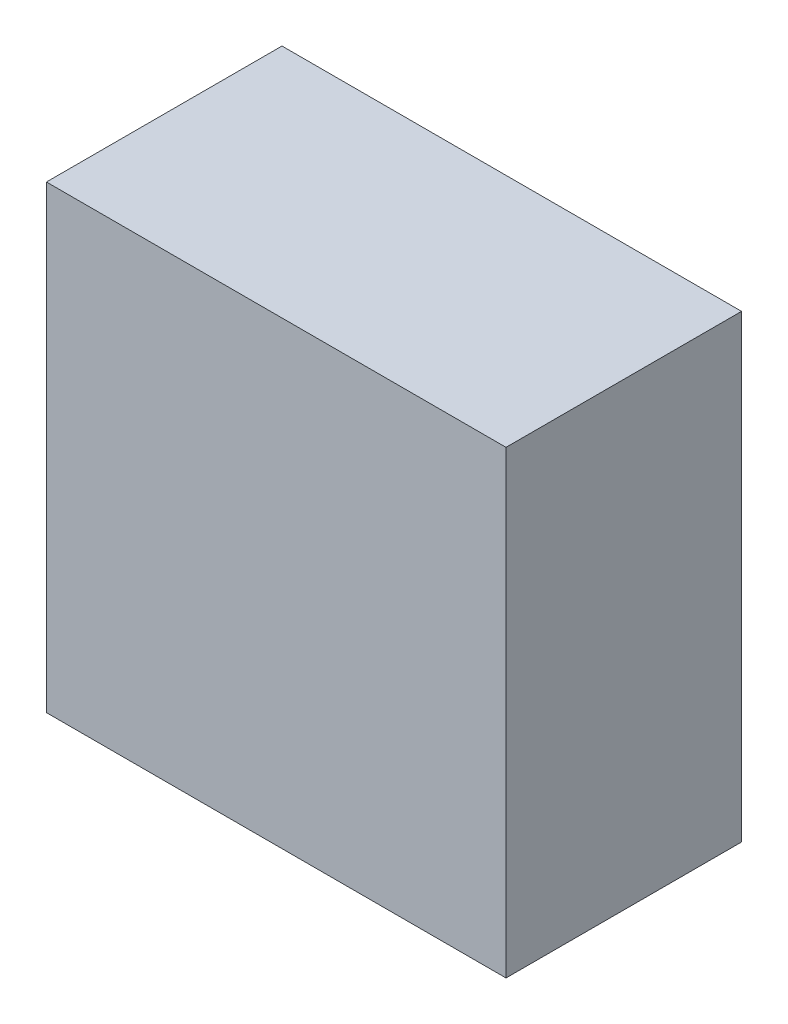
ISO-10303-21;
HEADER;
FILE_DESCRIPTION(('STEP AP214'),'2;1');
FILE_NAME('part.step','',(''),(''),'','','');
FILE_SCHEMA(('AUTOMOTIVE_DESIGN { 1 0 10303 214 1 1 1 1 }'));
ENDSEC;
DATA;
#1=APPLICATION_CONTEXT('core data for automotive mechanical design processes');
#2=APPLICATION_PROTOCOL_DEFINITION('international standard','automotive_design',2000,#1);
#3=PRODUCT_CONTEXT('',#1,'mechanical');
#4=PRODUCT('Part','Part','',(#3));
#5=PRODUCT_RELATED_PRODUCT_CATEGORY('part','',(#4));
#6=PRODUCT_DEFINITION_FORMATION('','',#4);
#7=PRODUCT_DEFINITION_CONTEXT('part definition',#1,'design');
#8=PRODUCT_DEFINITION('design','',#6,#7);
#9=PRODUCT_DEFINITION_SHAPE('','',#8);
#10=(LENGTH_UNIT() NAMED_UNIT(*) SI_UNIT(.MILLI.,.METRE.));
#11=(NAMED_UNIT(*) PLANE_ANGLE_UNIT() SI_UNIT($,.RADIAN.));
#12=(NAMED_UNIT(*) SI_UNIT($,.STERADIAN.) SOLID_ANGLE_UNIT());
#13=UNCERTAINTY_MEASURE_WITH_UNIT(LENGTH_MEASURE(1.E-05),#10,'distance_accuracy_value','');
#14=(GEOMETRIC_REPRESENTATION_CONTEXT(3) GLOBAL_UNCERTAINTY_ASSIGNED_CONTEXT((#13)) GLOBAL_UNIT_ASSIGNED_CONTEXT((#10,
#11,#12)) REPRESENTATION_CONTEXT('',''));
#15=CARTESIAN_POINT('',(0.,0.,0.));
#16=DIRECTION('',(0.,0.,1.));
#17=DIRECTION('',(1.,0.,0.));
#18=AXIS2_PLACEMENT_3D('',#15,#16,#17);
#19=CARTESIAN_POINT('',(-8.,-8.,4.1));
#20=DIRECTION('',(0.,0.,1.));
#21=DIRECTION('',(1.,0.,0.));
#22=AXIS2_PLACEMENT_3D('',#19,#20,#21);
#23=PLANE('',#22);
#24=DIRECTION('',(0.,1.,0.));
#25=VECTOR('',#24,1.);
#26=CARTESIAN_POINT('',(-8.,-8.,4.1));
#27=LINE('',#26,#25);
#28=CARTESIAN_POINT('',(-8.,-8.,4.1));
#29=VERTEX_POINT('',#28);
#30=CARTESIAN_POINT('',(-8.,8.,4.1));
#31=VERTEX_POINT('',#30);
#32=EDGE_CURVE('E86',#29,#31,#27,.T.);
#33=ORIENTED_EDGE('',*,*,#32,.F.);
#34=DIRECTION('',(1.,0.,0.));
#35=VECTOR('',#34,1.);
#36=CARTESIAN_POINT('',(-8.,-8.,4.1));
#37=LINE('',#36,#35);
#38=CARTESIAN_POINT('',(8.,-8.,4.1));
#39=VERTEX_POINT('',#38);
#40=EDGE_CURVE('E68',#29,#39,#37,.T.);
#41=ORIENTED_EDGE('',*,*,#40,.T.);
#42=DIRECTION('',(0.,1.,0.));
#43=VECTOR('',#42,1.);
#44=CARTESIAN_POINT('',(8.,-8.,4.1));
#45=LINE('',#44,#43);
#46=CARTESIAN_POINT('',(8.,8.,4.1));
#47=VERTEX_POINT('',#46);
#48=EDGE_CURVE('E80',#39,#47,#45,.T.);
#49=ORIENTED_EDGE('',*,*,#48,.T.);
#50=DIRECTION('',(1.,0.,0.));
#51=VECTOR('',#50,1.);
#52=CARTESIAN_POINT('',(-8.,8.,4.1));
#53=LINE('',#52,#51);
#54=EDGE_CURVE('E9',#31,#47,#53,.T.);
#55=ORIENTED_EDGE('',*,*,#54,.F.);
#56=EDGE_LOOP('',(#33,#41,#49,#55));
#57=FACE_BOUND('',#56,.T.);
#58=ADVANCED_FACE('F15',(#57),#23,.T.);
#59=CARTESIAN_POINT('',(-8.,-8.,-4.1));
#60=DIRECTION('',(0.,0.,1.));
#61=DIRECTION('',(1.,0.,0.));
#62=AXIS2_PLACEMENT_3D('',#59,#60,#61);
#63=PLANE('',#62);
#64=DIRECTION('',(1.,0.,0.));
#65=VECTOR('',#64,1.);
#66=CARTESIAN_POINT('',(-8.,8.,-4.1));
#67=LINE('',#66,#65);
#68=CARTESIAN_POINT('',(-8.,8.,-4.1));
#69=VERTEX_POINT('',#68);
#70=CARTESIAN_POINT('',(8.,8.,-4.1));
#71=VERTEX_POINT('',#70);
#72=EDGE_CURVE('E23',#69,#71,#67,.T.);
#73=ORIENTED_EDGE('',*,*,#72,.T.);
#74=DIRECTION('',(0.,1.,0.));
#75=VECTOR('',#74,1.);
#76=CARTESIAN_POINT('',(8.,-8.,-4.1));
#77=LINE('',#76,#75);
#78=CARTESIAN_POINT('',(8.,-8.,-4.1));
#79=VERTEX_POINT('',#78);
#80=EDGE_CURVE('E101',#79,#71,#77,.T.);
#81=ORIENTED_EDGE('',*,*,#80,.F.);
#82=DIRECTION('',(1.,0.,0.));
#83=VECTOR('',#82,1.);
#84=CARTESIAN_POINT('',(-8.,-8.,-4.1));
#85=LINE('',#84,#83);
#86=CARTESIAN_POINT('',(-8.,-8.,-4.1));
#87=VERTEX_POINT('',#86);
#88=EDGE_CURVE('E79',#87,#79,#85,.T.);
#89=ORIENTED_EDGE('',*,*,#88,.F.);
#90=DIRECTION('',(0.,1.,0.));
#91=VECTOR('',#90,1.);
#92=CARTESIAN_POINT('',(-8.,-8.,-4.1));
#93=LINE('',#92,#91);
#94=EDGE_CURVE('E87',#87,#69,#93,.T.);
#95=ORIENTED_EDGE('',*,*,#94,.T.);
#96=EDGE_LOOP('',(#73,#81,#89,#95));
#97=FACE_BOUND('',#96,.T.);
#98=ADVANCED_FACE('F114',(#97),#63,.F.);
#99=CARTESIAN_POINT('',(-8.,8.,-4.1));
#100=DIRECTION('',(0.,1.,0.));
#101=DIRECTION('',(1.,0.,0.));
#102=AXIS2_PLACEMENT_3D('',#99,#100,#101);
#103=PLANE('',#102);
#104=ORIENTED_EDGE('',*,*,#72,.F.);
#105=DIRECTION('',(0.,0.,1.));
#106=VECTOR('',#105,1.);
#107=CARTESIAN_POINT('',(-8.,8.,-4.1));
#108=LINE('',#107,#106);
#109=EDGE_CURVE('E91',#69,#31,#108,.T.);
#110=ORIENTED_EDGE('',*,*,#109,.T.);
#111=ORIENTED_EDGE('',*,*,#54,.T.);
#112=DIRECTION('',(0.,0.,1.));
#113=VECTOR('',#112,1.);
#114=CARTESIAN_POINT('',(8.,8.,-4.1));
#115=LINE('',#114,#113);
#116=EDGE_CURVE('E105',#71,#47,#115,.T.);
#117=ORIENTED_EDGE('',*,*,#116,.F.);
#118=EDGE_LOOP('',(#104,#110,#111,#117));
#119=FACE_BOUND('',#118,.T.);
#120=ADVANCED_FACE('F117',(#119),#103,.T.);
#121=CARTESIAN_POINT('',(-8.,-8.,-4.1));
#122=DIRECTION('',(0.,1.,0.));
#123=DIRECTION('',(1.,0.,0.));
#124=AXIS2_PLACEMENT_3D('',#121,#122,#123);
#125=PLANE('',#124);
#126=DIRECTION('',(0.,0.,1.));
#127=VECTOR('',#126,1.);
#128=CARTESIAN_POINT('',(8.,-8.,-4.1));
#129=LINE('',#128,#127);
#130=EDGE_CURVE('E74',#79,#39,#129,.T.);
#131=ORIENTED_EDGE('',*,*,#130,.T.);
#132=ORIENTED_EDGE('',*,*,#40,.F.);
#133=DIRECTION('',(0.,0.,1.));
#134=VECTOR('',#133,1.);
#135=CARTESIAN_POINT('',(-8.,-8.,-4.1));
#136=LINE('',#135,#134);
#137=EDGE_CURVE('E71',#87,#29,#136,.T.);
#138=ORIENTED_EDGE('',*,*,#137,.F.);
#139=ORIENTED_EDGE('',*,*,#88,.T.);
#140=EDGE_LOOP('',(#131,#132,#138,#139));
#141=FACE_BOUND('',#140,.T.);
#142=ADVANCED_FACE('F70',(#141),#125,.F.);
#143=CARTESIAN_POINT('',(8.,-8.,-4.1));
#144=DIRECTION('',(1.,0.,0.));
#145=DIRECTION('',(0.,1.,0.));
#146=AXIS2_PLACEMENT_3D('',#143,#144,#145);
#147=PLANE('',#146);
#148=ORIENTED_EDGE('',*,*,#130,.F.);
#149=ORIENTED_EDGE('',*,*,#80,.T.);
#150=ORIENTED_EDGE('',*,*,#116,.T.);
#151=ORIENTED_EDGE('',*,*,#48,.F.);
#152=EDGE_LOOP('',(#148,#149,#150,#151));
#153=FACE_BOUND('',#152,.T.);
#154=ADVANCED_FACE('F116',(#153),#147,.T.);
#155=CARTESIAN_POINT('',(-8.,-8.,-4.1));
#156=DIRECTION('',(1.,0.,0.));
#157=DIRECTION('',(0.,1.,0.));
#158=AXIS2_PLACEMENT_3D('',#155,#156,#157);
#159=PLANE('',#158);
#160=ORIENTED_EDGE('',*,*,#32,.T.);
#161=ORIENTED_EDGE('',*,*,#109,.F.);
#162=ORIENTED_EDGE('',*,*,#94,.F.);
#163=ORIENTED_EDGE('',*,*,#137,.T.);
#164=EDGE_LOOP('',(#160,#161,#162,#163));
#165=FACE_BOUND('',#164,.T.);
#166=ADVANCED_FACE('F84',(#165),#159,.F.);
#167=CLOSED_SHELL('',(#58,#98,#120,#142,#154,#166));
#168=MANIFOLD_SOLID_BREP('B1',#167);
#169=ADVANCED_BREP_SHAPE_REPRESENTATION('',(#18,#168),#14);
#170=SHAPE_DEFINITION_REPRESENTATION(#9,#169);
ENDSEC;
END-ISO-10303-21;
